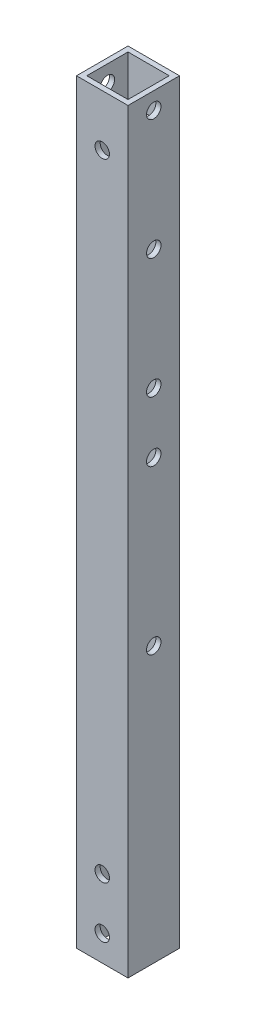
ISO-10303-21;
HEADER;
FILE_DESCRIPTION(('STEP AP214'),'2;1');
FILE_NAME('part.step','',(''),(''),'','','');
FILE_SCHEMA(('AUTOMOTIVE_DESIGN { 1 0 10303 214 1 1 1 1 }'));
ENDSEC;
DATA;
#1=APPLICATION_CONTEXT('core data for automotive mechanical design processes');
#2=APPLICATION_PROTOCOL_DEFINITION('international standard','automotive_design',2000,#1);
#3=PRODUCT_CONTEXT('',#1,'mechanical');
#4=PRODUCT('Part','Part','',(#3));
#5=PRODUCT_RELATED_PRODUCT_CATEGORY('part','',(#4));
#6=PRODUCT_DEFINITION_FORMATION('','',#4);
#7=PRODUCT_DEFINITION_CONTEXT('part definition',#1,'design');
#8=PRODUCT_DEFINITION('design','',#6,#7);
#9=PRODUCT_DEFINITION_SHAPE('','',#8);
#10=(LENGTH_UNIT() NAMED_UNIT(*) SI_UNIT(.MILLI.,.METRE.));
#11=(NAMED_UNIT(*) PLANE_ANGLE_UNIT() SI_UNIT($,.RADIAN.));
#12=(NAMED_UNIT(*) SI_UNIT($,.STERADIAN.) SOLID_ANGLE_UNIT());
#13=UNCERTAINTY_MEASURE_WITH_UNIT(LENGTH_MEASURE(1.E-05),#10,'distance_accuracy_value','');
#14=(GEOMETRIC_REPRESENTATION_CONTEXT(3) GLOBAL_UNCERTAINTY_ASSIGNED_CONTEXT((#13)) GLOBAL_UNIT_ASSIGNED_CONTEXT((#10,
#11,#12)) REPRESENTATION_CONTEXT('',''));
#15=CARTESIAN_POINT('',(0.,0.,0.));
#16=DIRECTION('',(0.,0.,1.));
#17=DIRECTION('',(1.,0.,0.));
#18=AXIS2_PLACEMENT_3D('',#15,#16,#17);
#19=CARTESIAN_POINT('',(0.,220.,0.));
#20=DIRECTION('',(0.,1.,0.));
#21=DIRECTION('',(0.,0.,1.));
#22=AXIS2_PLACEMENT_3D('',#19,#20,#21);
#23=PLANE('',#22);
#24=DIRECTION('',(0.,0.,-1.));
#25=VECTOR('',#24,1.);
#26=CARTESIAN_POINT('',(7.5,220.,-7.5));
#27=LINE('',#26,#25);
#28=CARTESIAN_POINT('',(7.5,220.,7.5));
#29=VERTEX_POINT('',#28);
#30=CARTESIAN_POINT('',(7.5,220.,-7.5));
#31=VERTEX_POINT('',#30);
#32=EDGE_CURVE('E164',#29,#31,#27,.T.);
#33=ORIENTED_EDGE('',*,*,#32,.T.);
#34=DIRECTION('',(-1.,0.,0.));
#35=VECTOR('',#34,1.);
#36=CARTESIAN_POINT('',(-7.5,220.,-7.5));
#37=LINE('',#36,#35);
#38=CARTESIAN_POINT('',(-7.5,220.,-7.5));
#39=VERTEX_POINT('',#38);
#40=EDGE_CURVE('E167',#31,#39,#37,.T.);
#41=ORIENTED_EDGE('',*,*,#40,.T.);
#42=DIRECTION('',(0.,0.,1.));
#43=VECTOR('',#42,1.);
#44=CARTESIAN_POINT('',(-7.5,220.,-7.5));
#45=LINE('',#44,#43);
#46=CARTESIAN_POINT('',(-7.5,220.,7.5));
#47=VERTEX_POINT('',#46);
#48=EDGE_CURVE('E170',#39,#47,#45,.T.);
#49=ORIENTED_EDGE('',*,*,#48,.T.);
#50=DIRECTION('',(1.,0.,0.));
#51=VECTOR('',#50,1.);
#52=CARTESIAN_POINT('',(-7.5,220.,7.5));
#53=LINE('',#52,#51);
#54=EDGE_CURVE('E172',#47,#29,#53,.T.);
#55=ORIENTED_EDGE('',*,*,#54,.T.);
#56=EDGE_LOOP('',(#33,#41,#49,#55));
#57=FACE_BOUND('',#56,.T.);
#58=DIRECTION('',(-1.,0.,0.));
#59=VECTOR('',#58,1.);
#60=CARTESIAN_POINT('',(-7.5,220.,-6.));
#61=LINE('',#60,#59);
#62=CARTESIAN_POINT('',(6.,220.,-6.));
#63=VERTEX_POINT('',#62);
#64=CARTESIAN_POINT('',(-6.,220.,-6.));
#65=VERTEX_POINT('',#64);
#66=EDGE_CURVE('E134',#63,#65,#61,.T.);
#67=ORIENTED_EDGE('',*,*,#66,.F.);
#68=DIRECTION('',(0.,0.,-1.));
#69=VECTOR('',#68,1.);
#70=CARTESIAN_POINT('',(6.,220.,-7.5));
#71=LINE('',#70,#69);
#72=CARTESIAN_POINT('',(6.,220.,6.));
#73=VERTEX_POINT('',#72);
#74=EDGE_CURVE('E126',#73,#63,#71,.T.);
#75=ORIENTED_EDGE('',*,*,#74,.F.);
#76=DIRECTION('',(1.,0.,0.));
#77=VECTOR('',#76,1.);
#78=CARTESIAN_POINT('',(-7.5,220.,6.));
#79=LINE('',#78,#77);
#80=CARTESIAN_POINT('',(-6.,220.,6.));
#81=VERTEX_POINT('',#80);
#82=EDGE_CURVE('E148',#81,#73,#79,.T.);
#83=ORIENTED_EDGE('',*,*,#82,.F.);
#84=DIRECTION('',(0.,0.,1.));
#85=VECTOR('',#84,1.);
#86=CARTESIAN_POINT('',(-6.,220.,-7.5));
#87=LINE('',#86,#85);
#88=EDGE_CURVE('E146',#65,#81,#87,.T.);
#89=ORIENTED_EDGE('',*,*,#88,.F.);
#90=EDGE_LOOP('',(#67,#75,#83,#89));
#91=FACE_BOUND('',#90,.T.);
#92=ADVANCED_FACE('F59',(#57,#91),#23,.T.);
#93=CARTESIAN_POINT('',(0.,0.,0.));
#94=DIRECTION('',(0.,1.,0.));
#95=DIRECTION('',(0.,0.,1.));
#96=AXIS2_PLACEMENT_3D('',#93,#94,#95);
#97=PLANE('',#96);
#98=DIRECTION('',(0.,0.,-1.));
#99=VECTOR('',#98,1.);
#100=CARTESIAN_POINT('',(7.5,0.,-7.5));
#101=LINE('',#100,#99);
#102=CARTESIAN_POINT('',(7.5,0.,7.5));
#103=VERTEX_POINT('',#102);
#104=CARTESIAN_POINT('',(7.5,0.,-7.5));
#105=VERTEX_POINT('',#104);
#106=EDGE_CURVE('E142',#103,#105,#101,.T.);
#107=ORIENTED_EDGE('',*,*,#106,.F.);
#108=DIRECTION('',(1.,0.,0.));
#109=VECTOR('',#108,1.);
#110=CARTESIAN_POINT('',(-7.5,0.,7.5));
#111=LINE('',#110,#109);
#112=CARTESIAN_POINT('',(-7.5,0.,7.5));
#113=VERTEX_POINT('',#112);
#114=EDGE_CURVE('E168',#113,#103,#111,.T.);
#115=ORIENTED_EDGE('',*,*,#114,.F.);
#116=DIRECTION('',(0.,0.,1.));
#117=VECTOR('',#116,1.);
#118=CARTESIAN_POINT('',(-7.5,0.,-7.5));
#119=LINE('',#118,#117);
#120=CARTESIAN_POINT('',(-7.5,0.,-7.5));
#121=VERTEX_POINT('',#120);
#122=EDGE_CURVE('E179',#121,#113,#119,.T.);
#123=ORIENTED_EDGE('',*,*,#122,.F.);
#124=DIRECTION('',(-1.,0.,0.));
#125=VECTOR('',#124,1.);
#126=CARTESIAN_POINT('',(-7.5,0.,-7.5));
#127=LINE('',#126,#125);
#128=EDGE_CURVE('E177',#105,#121,#127,.T.);
#129=ORIENTED_EDGE('',*,*,#128,.F.);
#130=EDGE_LOOP('',(#107,#115,#123,#129));
#131=FACE_BOUND('',#130,.T.);
#132=DIRECTION('',(0.,0.,-1.));
#133=VECTOR('',#132,1.);
#134=CARTESIAN_POINT('',(6.,0.,-7.5));
#135=LINE('',#134,#133);
#136=CARTESIAN_POINT('',(6.,0.,6.));
#137=VERTEX_POINT('',#136);
#138=CARTESIAN_POINT('',(6.,0.,-6.));
#139=VERTEX_POINT('',#138);
#140=EDGE_CURVE('E84',#137,#139,#135,.T.);
#141=ORIENTED_EDGE('',*,*,#140,.T.);
#142=DIRECTION('',(-1.,0.,0.));
#143=VECTOR('',#142,1.);
#144=CARTESIAN_POINT('',(-7.5,0.,-6.));
#145=LINE('',#144,#143);
#146=CARTESIAN_POINT('',(-6.,0.,-6.));
#147=VERTEX_POINT('',#146);
#148=EDGE_CURVE('E141',#139,#147,#145,.T.);
#149=ORIENTED_EDGE('',*,*,#148,.T.);
#150=DIRECTION('',(0.,0.,1.));
#151=VECTOR('',#150,1.);
#152=CARTESIAN_POINT('',(-6.,0.,-7.5));
#153=LINE('',#152,#151);
#154=CARTESIAN_POINT('',(-6.,0.,6.));
#155=VERTEX_POINT('',#154);
#156=EDGE_CURVE('E156',#147,#155,#153,.T.);
#157=ORIENTED_EDGE('',*,*,#156,.T.);
#158=DIRECTION('',(1.,0.,0.));
#159=VECTOR('',#158,1.);
#160=CARTESIAN_POINT('',(-7.5,0.,6.));
#161=LINE('',#160,#159);
#162=EDGE_CURVE('E135',#155,#137,#161,.T.);
#163=ORIENTED_EDGE('',*,*,#162,.T.);
#164=EDGE_LOOP('',(#141,#149,#157,#163));
#165=FACE_BOUND('',#164,.T.);
#166=ADVANCED_FACE('F305',(#131,#165),#97,.F.);
#167=CARTESIAN_POINT('',(7.5,220.,-7.5));
#168=DIRECTION('',(-1.,0.,0.));
#169=DIRECTION('',(0.,0.,1.));
#170=AXIS2_PLACEMENT_3D('',#167,#168,#169);
#171=PLANE('',#170);
#172=CARTESIAN_POINT('',(7.5,80.,0.));
#173=DIRECTION('',(1.,0.,0.));
#174=DIRECTION('',(0.,0.,-1.));
#175=AXIS2_PLACEMENT_3D('',#172,#173,#174);
#176=CIRCLE('',#175,2.1);
#177=CARTESIAN_POINT('',(7.5,80.,-2.10000000000002));
#178=VERTEX_POINT('',#177);
#179=EDGE_CURVE('E224',#178,#178,#176,.T.);
#180=ORIENTED_EDGE('',*,*,#179,.F.);
#181=EDGE_LOOP('',(#180));
#182=FACE_BOUND('',#181,.T.);
#183=CARTESIAN_POINT('',(7.5,127.5,0.));
#184=DIRECTION('',(1.,0.,0.));
#185=DIRECTION('',(0.,0.,-1.));
#186=AXIS2_PLACEMENT_3D('',#183,#184,#185);
#187=CIRCLE('',#186,2.09999999999999);
#188=CARTESIAN_POINT('',(7.5,127.5,-2.1));
#189=VERTEX_POINT('',#188);
#190=EDGE_CURVE('E234',#189,#189,#187,.T.);
#191=ORIENTED_EDGE('',*,*,#190,.F.);
#192=EDGE_LOOP('',(#191));
#193=FACE_BOUND('',#192,.T.);
#194=CARTESIAN_POINT('',(7.5,145.,0.));
#195=DIRECTION('',(1.,0.,0.));
#196=DIRECTION('',(0.,0.,-1.));
#197=AXIS2_PLACEMENT_3D('',#194,#195,#196);
#198=CIRCLE('',#197,2.1);
#199=CARTESIAN_POINT('',(7.5,145.,-2.10000000000001));
#200=VERTEX_POINT('',#199);
#201=EDGE_CURVE('E265',#200,#200,#198,.T.);
#202=ORIENTED_EDGE('',*,*,#201,.F.);
#203=EDGE_LOOP('',(#202));
#204=FACE_BOUND('',#203,.T.);
#205=CARTESIAN_POINT('',(7.5,180.,0.));
#206=DIRECTION('',(1.,0.,0.));
#207=DIRECTION('',(0.,0.,-1.));
#208=AXIS2_PLACEMENT_3D('',#205,#206,#207);
#209=CIRCLE('',#208,2.09999999999999);
#210=CARTESIAN_POINT('',(7.5,180.,-2.1));
#211=VERTEX_POINT('',#210);
#212=EDGE_CURVE('E262',#211,#211,#209,.T.);
#213=ORIENTED_EDGE('',*,*,#212,.F.);
#214=EDGE_LOOP('',(#213));
#215=FACE_BOUND('',#214,.T.);
#216=CARTESIAN_POINT('',(7.5,215.,0.));
#217=DIRECTION('',(1.,0.,0.));
#218=DIRECTION('',(0.,0.,-1.));
#219=AXIS2_PLACEMENT_3D('',#216,#217,#218);
#220=CIRCLE('',#219,2.09999999999999);
#221=CARTESIAN_POINT('',(7.5,215.,-2.09999999999998));
#222=VERTEX_POINT('',#221);
#223=EDGE_CURVE('E277',#222,#222,#220,.T.);
#224=ORIENTED_EDGE('',*,*,#223,.F.);
#225=EDGE_LOOP('',(#224));
#226=FACE_BOUND('',#225,.T.);
#227=ORIENTED_EDGE('',*,*,#106,.T.);
#228=DIRECTION('',(0.,-1.,0.));
#229=VECTOR('',#228,1.);
#230=CARTESIAN_POINT('',(7.5,220.,-7.5));
#231=LINE('',#230,#229);
#232=EDGE_CURVE('E12',#31,#105,#231,.T.);
#233=ORIENTED_EDGE('',*,*,#232,.F.);
#234=ORIENTED_EDGE('',*,*,#32,.F.);
#235=DIRECTION('',(0.,-1.,0.));
#236=VECTOR('',#235,1.);
#237=CARTESIAN_POINT('',(7.5,220.,7.5));
#238=LINE('',#237,#236);
#239=EDGE_CURVE('E174',#29,#103,#238,.T.);
#240=ORIENTED_EDGE('',*,*,#239,.T.);
#241=EDGE_LOOP('',(#227,#233,#234,#240));
#242=FACE_BOUND('',#241,.T.);
#243=ADVANCED_FACE('F61',(#182,#193,#204,#215,#226,#242),#171,.F.);
#244=CARTESIAN_POINT('',(-7.5,220.,-7.5));
#245=DIRECTION('',(0.,0.,1.));
#246=DIRECTION('',(1.,0.,0.));
#247=AXIS2_PLACEMENT_3D('',#244,#245,#246);
#248=PLANE('',#247);
#249=CARTESIAN_POINT('',(0.,22.5,-7.5));
#250=DIRECTION('',(0.,0.,1.));
#251=DIRECTION('',(1.,0.,0.));
#252=AXIS2_PLACEMENT_3D('',#249,#250,#251);
#253=CIRCLE('',#252,2.1);
#254=CARTESIAN_POINT('',(2.1,22.5,-7.5));
#255=VERTEX_POINT('',#254);
#256=EDGE_CURVE('E211',#255,#255,#253,.T.);
#257=ORIENTED_EDGE('',*,*,#256,.T.);
#258=EDGE_LOOP('',(#257));
#259=FACE_BOUND('',#258,.T.);
#260=CARTESIAN_POINT('',(0.,7.5,-7.5));
#261=DIRECTION('',(0.,0.,1.));
#262=DIRECTION('',(1.,0.,0.));
#263=AXIS2_PLACEMENT_3D('',#260,#261,#262);
#264=CIRCLE('',#263,2.1);
#265=CARTESIAN_POINT('',(2.1,7.5,-7.5));
#266=VERTEX_POINT('',#265);
#267=EDGE_CURVE('E246',#266,#266,#264,.T.);
#268=ORIENTED_EDGE('',*,*,#267,.T.);
#269=EDGE_LOOP('',(#268));
#270=FACE_BOUND('',#269,.T.);
#271=CARTESIAN_POINT('',(0.,205.,-7.5));
#272=DIRECTION('',(0.,0.,1.));
#273=DIRECTION('',(1.,0.,0.));
#274=AXIS2_PLACEMENT_3D('',#271,#272,#273);
#275=CIRCLE('',#274,2.09999999999999);
#276=CARTESIAN_POINT('',(2.09999999999999,205.,-7.5));
#277=VERTEX_POINT('',#276);
#278=EDGE_CURVE('E206',#277,#277,#275,.T.);
#279=ORIENTED_EDGE('',*,*,#278,.T.);
#280=EDGE_LOOP('',(#279));
#281=FACE_BOUND('',#280,.T.);
#282=ORIENTED_EDGE('',*,*,#128,.T.);
#283=DIRECTION('',(0.,-1.,0.));
#284=VECTOR('',#283,1.);
#285=CARTESIAN_POINT('',(-7.5,220.,-7.5));
#286=LINE('',#285,#284);
#287=EDGE_CURVE('E68',#39,#121,#286,.T.);
#288=ORIENTED_EDGE('',*,*,#287,.F.);
#289=ORIENTED_EDGE('',*,*,#40,.F.);
#290=ORIENTED_EDGE('',*,*,#232,.T.);
#291=EDGE_LOOP('',(#282,#288,#289,#290));
#292=FACE_BOUND('',#291,.T.);
#293=ADVANCED_FACE('F314',(#259,#270,#281,#292),#248,.F.);
#294=CARTESIAN_POINT('',(-7.5,220.,-7.5));
#295=DIRECTION('',(1.,0.,0.));
#296=DIRECTION('',(0.,0.,-1.));
#297=AXIS2_PLACEMENT_3D('',#294,#295,#296);
#298=PLANE('',#297);
#299=CARTESIAN_POINT('',(-7.50000000000001,80.,0.));
#300=DIRECTION('',(1.,0.,0.));
#301=DIRECTION('',(0.,0.,-1.));
#302=AXIS2_PLACEMENT_3D('',#299,#300,#301);
#303=CIRCLE('',#302,2.1);
#304=CARTESIAN_POINT('',(-7.50000000000001,80.,-2.10000000000002));
#305=VERTEX_POINT('',#304);
#306=EDGE_CURVE('E218',#305,#305,#303,.T.);
#307=ORIENTED_EDGE('',*,*,#306,.T.);
#308=EDGE_LOOP('',(#307));
#309=FACE_BOUND('',#308,.T.);
#310=CARTESIAN_POINT('',(-7.50000000000001,127.5,0.));
#311=DIRECTION('',(1.,0.,0.));
#312=DIRECTION('',(0.,0.,-1.));
#313=AXIS2_PLACEMENT_3D('',#310,#311,#312);
#314=CIRCLE('',#313,2.09999999999999);
#315=CARTESIAN_POINT('',(-7.50000000000001,127.5,-2.1));
#316=VERTEX_POINT('',#315);
#317=EDGE_CURVE('E229',#316,#316,#314,.T.);
#318=ORIENTED_EDGE('',*,*,#317,.T.);
#319=EDGE_LOOP('',(#318));
#320=FACE_BOUND('',#319,.T.);
#321=CARTESIAN_POINT('',(-7.5,145.,0.));
#322=DIRECTION('',(1.,0.,0.));
#323=DIRECTION('',(0.,0.,-1.));
#324=AXIS2_PLACEMENT_3D('',#321,#322,#323);
#325=CIRCLE('',#324,2.1);
#326=CARTESIAN_POINT('',(-7.5,145.,-2.10000000000001));
#327=VERTEX_POINT('',#326);
#328=EDGE_CURVE('E197',#327,#327,#325,.T.);
#329=ORIENTED_EDGE('',*,*,#328,.T.);
#330=EDGE_LOOP('',(#329));
#331=FACE_BOUND('',#330,.T.);
#332=CARTESIAN_POINT('',(-7.5,180.,0.));
#333=DIRECTION('',(1.,0.,0.));
#334=DIRECTION('',(0.,0.,-1.));
#335=AXIS2_PLACEMENT_3D('',#332,#333,#334);
#336=CIRCLE('',#335,2.09999999999999);
#337=CARTESIAN_POINT('',(-7.5,180.,-2.1));
#338=VERTEX_POINT('',#337);
#339=EDGE_CURVE('E268',#338,#338,#336,.T.);
#340=ORIENTED_EDGE('',*,*,#339,.T.);
#341=EDGE_LOOP('',(#340));
#342=FACE_BOUND('',#341,.T.);
#343=CARTESIAN_POINT('',(-7.5,215.,0.));
#344=DIRECTION('',(1.,0.,0.));
#345=DIRECTION('',(0.,0.,-1.));
#346=AXIS2_PLACEMENT_3D('',#343,#344,#345);
#347=CIRCLE('',#346,2.09999999999999);
#348=CARTESIAN_POINT('',(-7.5,215.,-2.09999999999998));
#349=VERTEX_POINT('',#348);
#350=EDGE_CURVE('E192',#349,#349,#347,.T.);
#351=ORIENTED_EDGE('',*,*,#350,.T.);
#352=EDGE_LOOP('',(#351));
#353=FACE_BOUND('',#352,.T.);
#354=ORIENTED_EDGE('',*,*,#122,.T.);
#355=DIRECTION('',(0.,-1.,0.));
#356=VECTOR('',#355,1.);
#357=CARTESIAN_POINT('',(-7.5,220.,7.5));
#358=LINE('',#357,#356);
#359=EDGE_CURVE('E184',#47,#113,#358,.T.);
#360=ORIENTED_EDGE('',*,*,#359,.F.);
#361=ORIENTED_EDGE('',*,*,#48,.F.);
#362=ORIENTED_EDGE('',*,*,#287,.T.);
#363=EDGE_LOOP('',(#354,#360,#361,#362));
#364=FACE_BOUND('',#363,.T.);
#365=ADVANCED_FACE('F298',(#309,#320,#331,#342,#353,#364),#298,.F.);
#366=CARTESIAN_POINT('',(-7.5,220.,7.5));
#367=DIRECTION('',(0.,0.,-1.));
#368=DIRECTION('',(-1.,0.,0.));
#369=AXIS2_PLACEMENT_3D('',#366,#367,#368);
#370=PLANE('',#369);
#371=CARTESIAN_POINT('',(0.,22.5,7.5));
#372=DIRECTION('',(0.,0.,1.));
#373=DIRECTION('',(1.,0.,0.));
#374=AXIS2_PLACEMENT_3D('',#371,#372,#373);
#375=CIRCLE('',#374,2.1);
#376=CARTESIAN_POINT('',(2.1,22.5,7.5));
#377=VERTEX_POINT('',#376);
#378=EDGE_CURVE('E243',#377,#377,#375,.T.);
#379=ORIENTED_EDGE('',*,*,#378,.F.);
#380=EDGE_LOOP('',(#379));
#381=FACE_BOUND('',#380,.T.);
#382=CARTESIAN_POINT('',(0.,7.5,7.5));
#383=DIRECTION('',(0.,0.,1.));
#384=DIRECTION('',(1.,0.,0.));
#385=AXIS2_PLACEMENT_3D('',#382,#383,#384);
#386=CIRCLE('',#385,2.1);
#387=CARTESIAN_POINT('',(2.1,7.5,7.5));
#388=VERTEX_POINT('',#387);
#389=EDGE_CURVE('E240',#388,#388,#386,.T.);
#390=ORIENTED_EDGE('',*,*,#389,.F.);
#391=EDGE_LOOP('',(#390));
#392=FACE_BOUND('',#391,.T.);
#393=CARTESIAN_POINT('',(0.,205.,7.5));
#394=DIRECTION('',(0.,0.,1.));
#395=DIRECTION('',(1.,0.,0.));
#396=AXIS2_PLACEMENT_3D('',#393,#394,#395);
#397=CIRCLE('',#396,2.09999999999999);
#398=CARTESIAN_POINT('',(2.09999999999999,205.,7.5));
#399=VERTEX_POINT('',#398);
#400=EDGE_CURVE('E255',#399,#399,#397,.T.);
#401=ORIENTED_EDGE('',*,*,#400,.F.);
#402=EDGE_LOOP('',(#401));
#403=FACE_BOUND('',#402,.T.);
#404=ORIENTED_EDGE('',*,*,#114,.T.);
#405=ORIENTED_EDGE('',*,*,#239,.F.);
#406=ORIENTED_EDGE('',*,*,#54,.F.);
#407=ORIENTED_EDGE('',*,*,#359,.T.);
#408=EDGE_LOOP('',(#404,#405,#406,#407));
#409=FACE_BOUND('',#408,.T.);
#410=ADVANCED_FACE('F288',(#381,#392,#403,#409),#370,.F.);
#411=CARTESIAN_POINT('',(6.,220.,-7.5));
#412=DIRECTION('',(-1.,0.,0.));
#413=DIRECTION('',(0.,0.,1.));
#414=AXIS2_PLACEMENT_3D('',#411,#412,#413);
#415=PLANE('',#414);
#416=CARTESIAN_POINT('',(6.,80.,0.));
#417=DIRECTION('',(-1.,0.,0.));
#418=DIRECTION('',(0.,0.,1.));
#419=AXIS2_PLACEMENT_3D('',#416,#417,#418);
#420=CIRCLE('',#419,2.1);
#421=CARTESIAN_POINT('',(6.,80.,2.09999999999999));
#422=VERTEX_POINT('',#421);
#423=EDGE_CURVE('E237',#422,#422,#420,.T.);
#424=ORIENTED_EDGE('',*,*,#423,.F.);
#425=EDGE_LOOP('',(#424));
#426=FACE_BOUND('',#425,.T.);
#427=CARTESIAN_POINT('',(6.,127.5,0.));
#428=DIRECTION('',(-1.,0.,0.));
#429=DIRECTION('',(0.,0.,1.));
#430=AXIS2_PLACEMENT_3D('',#427,#428,#429);
#431=CIRCLE('',#430,2.09999999999999);
#432=CARTESIAN_POINT('',(6.,127.5,2.09999999999998));
#433=VERTEX_POINT('',#432);
#434=EDGE_CURVE('E217',#433,#433,#431,.T.);
#435=ORIENTED_EDGE('',*,*,#434,.F.);
#436=EDGE_LOOP('',(#435));
#437=FACE_BOUND('',#436,.T.);
#438=CARTESIAN_POINT('',(6.,145.,0.));
#439=DIRECTION('',(-1.,0.,0.));
#440=DIRECTION('',(0.,0.,1.));
#441=AXIS2_PLACEMENT_3D('',#438,#439,#440);
#442=CIRCLE('',#441,2.1);
#443=CARTESIAN_POINT('',(6.,145.,2.09999999999999));
#444=VERTEX_POINT('',#443);
#445=EDGE_CURVE('E201',#444,#444,#442,.T.);
#446=ORIENTED_EDGE('',*,*,#445,.F.);
#447=EDGE_LOOP('',(#446));
#448=FACE_BOUND('',#447,.T.);
#449=CARTESIAN_POINT('',(6.,180.,0.));
#450=DIRECTION('',(-1.,0.,0.));
#451=DIRECTION('',(0.,0.,1.));
#452=AXIS2_PLACEMENT_3D('',#449,#450,#451);
#453=CIRCLE('',#452,2.09999999999999);
#454=CARTESIAN_POINT('',(6.,180.,2.09999999999999));
#455=VERTEX_POINT('',#454);
#456=EDGE_CURVE('E196',#455,#455,#453,.T.);
#457=ORIENTED_EDGE('',*,*,#456,.F.);
#458=EDGE_LOOP('',(#457));
#459=FACE_BOUND('',#458,.T.);
#460=CARTESIAN_POINT('',(6.,215.,0.));
#461=DIRECTION('',(-1.,0.,0.));
#462=DIRECTION('',(0.,0.,1.));
#463=AXIS2_PLACEMENT_3D('',#460,#461,#462);
#464=CIRCLE('',#463,2.09999999999999);
#465=CARTESIAN_POINT('',(6.,215.,-2.09999999999998));
#466=VERTEX_POINT('',#465);
#467=EDGE_CURVE('E154',#466,#466,#464,.T.);
#468=ORIENTED_EDGE('',*,*,#467,.F.);
#469=EDGE_LOOP('',(#468));
#470=FACE_BOUND('',#469,.T.);
#471=ORIENTED_EDGE('',*,*,#140,.F.);
#472=DIRECTION('',(0.,-1.,0.));
#473=VECTOR('',#472,1.);
#474=CARTESIAN_POINT('',(6.,220.,6.));
#475=LINE('',#474,#473);
#476=EDGE_CURVE('E130',#73,#137,#475,.T.);
#477=ORIENTED_EDGE('',*,*,#476,.F.);
#478=ORIENTED_EDGE('',*,*,#74,.T.);
#479=DIRECTION('',(0.,-1.,0.));
#480=VECTOR('',#479,1.);
#481=CARTESIAN_POINT('',(6.,220.,-6.));
#482=LINE('',#481,#480);
#483=EDGE_CURVE('E129',#63,#139,#482,.T.);
#484=ORIENTED_EDGE('',*,*,#483,.T.);
#485=EDGE_LOOP('',(#471,#477,#478,#484));
#486=FACE_BOUND('',#485,.T.);
#487=ADVANCED_FACE('F128',(#426,#437,#448,#459,#470,#486),#415,.T.);
#488=CARTESIAN_POINT('',(-7.5,220.,-6.));
#489=DIRECTION('',(0.,0.,1.));
#490=DIRECTION('',(1.,0.,0.));
#491=AXIS2_PLACEMENT_3D('',#488,#489,#490);
#492=PLANE('',#491);
#493=CARTESIAN_POINT('',(0.,22.5,-6.));
#494=DIRECTION('',(0.,0.,1.));
#495=DIRECTION('',(1.,0.,0.));
#496=AXIS2_PLACEMENT_3D('',#493,#494,#495);
#497=CIRCLE('',#496,2.1);
#498=CARTESIAN_POINT('',(2.1,22.5,-6.));
#499=VERTEX_POINT('',#498);
#500=EDGE_CURVE('E214',#499,#499,#497,.T.);
#501=ORIENTED_EDGE('',*,*,#500,.F.);
#502=EDGE_LOOP('',(#501));
#503=FACE_BOUND('',#502,.T.);
#504=CARTESIAN_POINT('',(0.,7.5,-6.));
#505=DIRECTION('',(0.,0.,1.));
#506=DIRECTION('',(1.,0.,0.));
#507=AXIS2_PLACEMENT_3D('',#504,#505,#506);
#508=CIRCLE('',#507,2.1);
#509=CARTESIAN_POINT('',(2.1,7.5,-6.));
#510=VERTEX_POINT('',#509);
#511=EDGE_CURVE('E210',#510,#510,#508,.T.);
#512=ORIENTED_EDGE('',*,*,#511,.F.);
#513=EDGE_LOOP('',(#512));
#514=FACE_BOUND('',#513,.T.);
#515=CARTESIAN_POINT('',(0.,205.,-6.));
#516=DIRECTION('',(0.,0.,1.));
#517=DIRECTION('',(1.,0.,0.));
#518=AXIS2_PLACEMENT_3D('',#515,#516,#517);
#519=CIRCLE('',#518,2.09999999999999);
#520=CARTESIAN_POINT('',(2.09999999999999,205.,-6.));
#521=VERTEX_POINT('',#520);
#522=EDGE_CURVE('E205',#521,#521,#519,.T.);
#523=ORIENTED_EDGE('',*,*,#522,.F.);
#524=EDGE_LOOP('',(#523));
#525=FACE_BOUND('',#524,.T.);
#526=ORIENTED_EDGE('',*,*,#148,.F.);
#527=ORIENTED_EDGE('',*,*,#483,.F.);
#528=ORIENTED_EDGE('',*,*,#66,.T.);
#529=DIRECTION('',(0.,-1.,0.));
#530=VECTOR('',#529,1.);
#531=CARTESIAN_POINT('',(-6.,220.,-6.));
#532=LINE('',#531,#530);
#533=EDGE_CURVE('E143',#65,#147,#532,.T.);
#534=ORIENTED_EDGE('',*,*,#533,.T.);
#535=EDGE_LOOP('',(#526,#527,#528,#534));
#536=FACE_BOUND('',#535,.T.);
#537=ADVANCED_FACE('F138',(#503,#514,#525,#536),#492,.T.);
#538=CARTESIAN_POINT('',(-6.,220.,-7.5));
#539=DIRECTION('',(1.,0.,0.));
#540=DIRECTION('',(0.,0.,-1.));
#541=AXIS2_PLACEMENT_3D('',#538,#539,#540);
#542=PLANE('',#541);
#543=CARTESIAN_POINT('',(-6.,80.,0.));
#544=DIRECTION('',(1.,0.,0.));
#545=DIRECTION('',(0.,0.,-1.));
#546=AXIS2_PLACEMENT_3D('',#543,#544,#545);
#547=CIRCLE('',#546,2.1);
#548=CARTESIAN_POINT('',(-6.,80.,-2.10000000000002));
#549=VERTEX_POINT('',#548);
#550=EDGE_CURVE('E63',#549,#549,#547,.T.);
#551=ORIENTED_EDGE('',*,*,#550,.F.);
#552=EDGE_LOOP('',(#551));
#553=FACE_BOUND('',#552,.T.);
#554=CARTESIAN_POINT('',(-6.,127.5,0.));
#555=DIRECTION('',(1.,0.,0.));
#556=DIRECTION('',(0.,0.,-1.));
#557=AXIS2_PLACEMENT_3D('',#554,#555,#556);
#558=CIRCLE('',#557,2.09999999999999);
#559=CARTESIAN_POINT('',(-6.,127.5,-2.1));
#560=VERTEX_POINT('',#559);
#561=EDGE_CURVE('E215',#560,#560,#558,.T.);
#562=ORIENTED_EDGE('',*,*,#561,.F.);
#563=EDGE_LOOP('',(#562));
#564=FACE_BOUND('',#563,.T.);
#565=CARTESIAN_POINT('',(-6.,145.,0.));
#566=DIRECTION('',(1.,0.,0.));
#567=DIRECTION('',(0.,0.,-1.));
#568=AXIS2_PLACEMENT_3D('',#565,#566,#567);
#569=CIRCLE('',#568,2.1);
#570=CARTESIAN_POINT('',(-6.,145.,-2.10000000000001));
#571=VERTEX_POINT('',#570);
#572=EDGE_CURVE('E198',#571,#571,#569,.T.);
#573=ORIENTED_EDGE('',*,*,#572,.F.);
#574=EDGE_LOOP('',(#573));
#575=FACE_BOUND('',#574,.T.);
#576=CARTESIAN_POINT('',(-6.,180.,0.));
#577=DIRECTION('',(1.,0.,0.));
#578=DIRECTION('',(0.,0.,-1.));
#579=AXIS2_PLACEMENT_3D('',#576,#577,#578);
#580=CIRCLE('',#579,2.09999999999999);
#581=CARTESIAN_POINT('',(-6.,180.,-2.1));
#582=VERTEX_POINT('',#581);
#583=EDGE_CURVE('E193',#582,#582,#580,.T.);
#584=ORIENTED_EDGE('',*,*,#583,.F.);
#585=EDGE_LOOP('',(#584));
#586=FACE_BOUND('',#585,.T.);
#587=CARTESIAN_POINT('',(-6.,215.,0.));
#588=DIRECTION('',(1.,0.,0.));
#589=DIRECTION('',(0.,0.,-1.));
#590=AXIS2_PLACEMENT_3D('',#587,#588,#589);
#591=CIRCLE('',#590,2.09999999999999);
#592=CARTESIAN_POINT('',(-6.,215.,-2.09999999999998));
#593=VERTEX_POINT('',#592);
#594=EDGE_CURVE('E189',#593,#593,#591,.T.);
#595=ORIENTED_EDGE('',*,*,#594,.F.);
#596=EDGE_LOOP('',(#595));
#597=FACE_BOUND('',#596,.T.);
#598=ORIENTED_EDGE('',*,*,#156,.F.);
#599=ORIENTED_EDGE('',*,*,#533,.F.);
#600=ORIENTED_EDGE('',*,*,#88,.T.);
#601=DIRECTION('',(0.,-1.,0.));
#602=VECTOR('',#601,1.);
#603=CARTESIAN_POINT('',(-6.,220.,6.));
#604=LINE('',#603,#602);
#605=EDGE_CURVE('E76',#81,#155,#604,.T.);
#606=ORIENTED_EDGE('',*,*,#605,.T.);
#607=EDGE_LOOP('',(#598,#599,#600,#606));
#608=FACE_BOUND('',#607,.T.);
#609=ADVANCED_FACE('F295',(#553,#564,#575,#586,#597,#608),#542,.T.);
#610=CARTESIAN_POINT('',(-7.5,220.,6.));
#611=DIRECTION('',(0.,0.,-1.));
#612=DIRECTION('',(-1.,0.,0.));
#613=AXIS2_PLACEMENT_3D('',#610,#611,#612);
#614=PLANE('',#613);
#615=CARTESIAN_POINT('',(0.,22.5,6.));
#616=DIRECTION('',(0.,0.,-1.));
#617=DIRECTION('',(-1.,0.,0.));
#618=AXIS2_PLACEMENT_3D('',#615,#616,#617);
#619=CIRCLE('',#618,2.1);
#620=CARTESIAN_POINT('',(-2.1,22.5,6.));
#621=VERTEX_POINT('',#620);
#622=EDGE_CURVE('E212',#621,#621,#619,.T.);
#623=ORIENTED_EDGE('',*,*,#622,.F.);
#624=EDGE_LOOP('',(#623));
#625=FACE_BOUND('',#624,.T.);
#626=CARTESIAN_POINT('',(0.,7.5,6.));
#627=DIRECTION('',(0.,0.,-1.));
#628=DIRECTION('',(-1.,0.,0.));
#629=AXIS2_PLACEMENT_3D('',#626,#627,#628);
#630=CIRCLE('',#629,2.1);
#631=CARTESIAN_POINT('',(-2.1,7.5,6.));
#632=VERTEX_POINT('',#631);
#633=EDGE_CURVE('E207',#632,#632,#630,.T.);
#634=ORIENTED_EDGE('',*,*,#633,.F.);
#635=EDGE_LOOP('',(#634));
#636=FACE_BOUND('',#635,.T.);
#637=CARTESIAN_POINT('',(0.,205.,6.));
#638=DIRECTION('',(0.,0.,-1.));
#639=DIRECTION('',(-1.,0.,0.));
#640=AXIS2_PLACEMENT_3D('',#637,#638,#639);
#641=CIRCLE('',#640,2.09999999999999);
#642=CARTESIAN_POINT('',(-2.09999999999999,205.,6.));
#643=VERTEX_POINT('',#642);
#644=EDGE_CURVE('E202',#643,#643,#641,.T.);
#645=ORIENTED_EDGE('',*,*,#644,.F.);
#646=EDGE_LOOP('',(#645));
#647=FACE_BOUND('',#646,.T.);
#648=ORIENTED_EDGE('',*,*,#162,.F.);
#649=ORIENTED_EDGE('',*,*,#605,.F.);
#650=ORIENTED_EDGE('',*,*,#82,.T.);
#651=ORIENTED_EDGE('',*,*,#476,.T.);
#652=EDGE_LOOP('',(#648,#649,#650,#651));
#653=FACE_BOUND('',#652,.T.);
#654=ADVANCED_FACE('F342',(#625,#636,#647,#653),#614,.T.);
#655=CARTESIAN_POINT('',(-7.5,215.,0.));
#656=DIRECTION('',(1.,0.,0.));
#657=DIRECTION('',(0.,0.,-1.));
#658=AXIS2_PLACEMENT_3D('',#655,#656,#657);
#659=CYLINDRICAL_SURFACE('',#658,2.09999999999999);
#660=CARTESIAN_POINT('',(-6.,215.,-2.09999999999998));
#661=CARTESIAN_POINT('',(-6.015625,215.,-2.09999999999998));
#662=CARTESIAN_POINT('',(-6.03125,215.,-2.09999999999998));
#663=CARTESIAN_POINT('',(-6.0625,215.,-2.09999999999998));
#664=CARTESIAN_POINT('',(-6.078125,215.,-2.09999999999998));
#665=CARTESIAN_POINT('',(-6.109375,215.,-2.09999999999998));
#666=CARTESIAN_POINT('',(-6.125,215.,-2.09999999999998));
#667=CARTESIAN_POINT('',(-6.15625,215.,-2.09999999999998));
#668=CARTESIAN_POINT('',(-6.171875,215.,-2.09999999999998));
#669=CARTESIAN_POINT('',(-6.203125,215.,-2.09999999999998));
#670=CARTESIAN_POINT('',(-6.21875,215.,-2.09999999999998));
#671=CARTESIAN_POINT('',(-6.25,215.,-2.09999999999998));
#672=CARTESIAN_POINT('',(-6.265625,215.,-2.09999999999998));
#673=CARTESIAN_POINT('',(-6.296875,215.,-2.09999999999998));
#674=CARTESIAN_POINT('',(-6.3125,215.,-2.09999999999998));
#675=CARTESIAN_POINT('',(-6.34375,215.,-2.09999999999998));
#676=CARTESIAN_POINT('',(-6.359375,215.,-2.09999999999998));
#677=CARTESIAN_POINT('',(-6.390625,215.,-2.09999999999998));
#678=CARTESIAN_POINT('',(-6.40625,215.,-2.09999999999998));
#679=CARTESIAN_POINT('',(-6.4375,215.,-2.09999999999998));
#680=CARTESIAN_POINT('',(-6.453125,215.,-2.09999999999998));
#681=CARTESIAN_POINT('',(-6.484375,215.,-2.09999999999998));
#682=CARTESIAN_POINT('',(-6.5,215.,-2.09999999999998));
#683=CARTESIAN_POINT('',(-6.53125,215.,-2.09999999999998));
#684=CARTESIAN_POINT('',(-6.546875,215.,-2.09999999999998));
#685=CARTESIAN_POINT('',(-6.578125,215.,-2.09999999999998));
#686=CARTESIAN_POINT('',(-6.59375,215.,-2.09999999999998));
#687=CARTESIAN_POINT('',(-6.625,215.,-2.09999999999998));
#688=CARTESIAN_POINT('',(-6.640625,215.,-2.09999999999998));
#689=CARTESIAN_POINT('',(-6.671875,215.,-2.09999999999998));
#690=CARTESIAN_POINT('',(-6.6875,215.,-2.09999999999998));
#691=CARTESIAN_POINT('',(-6.71875,215.,-2.09999999999998));
#692=CARTESIAN_POINT('',(-6.734375,215.,-2.09999999999998));
#693=CARTESIAN_POINT('',(-6.765625,215.,-2.09999999999998));
#694=CARTESIAN_POINT('',(-6.78125,215.,-2.09999999999998));
#695=CARTESIAN_POINT('',(-6.8125,215.,-2.09999999999998));
#696=CARTESIAN_POINT('',(-6.828125,215.,-2.09999999999998));
#697=CARTESIAN_POINT('',(-6.859375,215.,-2.09999999999998));
#698=CARTESIAN_POINT('',(-6.875,215.,-2.09999999999998));
#699=CARTESIAN_POINT('',(-6.90625,215.,-2.09999999999998));
#700=CARTESIAN_POINT('',(-6.921875,215.,-2.09999999999998));
#701=CARTESIAN_POINT('',(-6.953125,215.,-2.09999999999998));
#702=CARTESIAN_POINT('',(-6.96875,215.,-2.09999999999998));
#703=CARTESIAN_POINT('',(-7.,215.,-2.09999999999998));
#704=CARTESIAN_POINT('',(-7.015625,215.,-2.09999999999998));
#705=CARTESIAN_POINT('',(-7.046875,215.,-2.09999999999998));
#706=CARTESIAN_POINT('',(-7.0625,215.,-2.09999999999998));
#707=CARTESIAN_POINT('',(-7.09375,215.,-2.09999999999998));
#708=CARTESIAN_POINT('',(-7.109375,215.,-2.09999999999998));
#709=CARTESIAN_POINT('',(-7.140625,215.,-2.09999999999998));
#710=CARTESIAN_POINT('',(-7.15625,215.,-2.09999999999998));
#711=CARTESIAN_POINT('',(-7.1875,215.,-2.09999999999998));
#712=CARTESIAN_POINT('',(-7.203125,215.,-2.09999999999998));
#713=CARTESIAN_POINT('',(-7.234375,215.,-2.09999999999998));
#714=CARTESIAN_POINT('',(-7.25,215.,-2.09999999999998));
#715=CARTESIAN_POINT('',(-7.28125,215.,-2.09999999999998));
#716=CARTESIAN_POINT('',(-7.296875,215.,-2.09999999999998));
#717=CARTESIAN_POINT('',(-7.328125,215.,-2.09999999999998));
#718=CARTESIAN_POINT('',(-7.34375,215.,-2.09999999999998));
#719=CARTESIAN_POINT('',(-7.375,215.,-2.09999999999998));
#720=CARTESIAN_POINT('',(-7.390625,215.,-2.09999999999998));
#721=CARTESIAN_POINT('',(-7.421875,215.,-2.09999999999998));
#722=CARTESIAN_POINT('',(-7.4375,215.,-2.09999999999998));
#723=CARTESIAN_POINT('',(-7.46875,215.,-2.09999999999998));
#724=CARTESIAN_POINT('',(-7.484375,215.,-2.09999999999998));
#725=CARTESIAN_POINT('',(-7.5,215.,-2.09999999999998));
#726=B_SPLINE_CURVE_WITH_KNOTS('',3,(#660,#661,#662,#663,#664,#665,#666,#667,#668,#669,#670,
#671,#672,#673,#674,#675,#676,#677,#678,#679,#680,#681,#682,#683,#684,#685,#686,#687,#688,#689,
#690,#691,#692,#693,#694,#695,#696,#697,#698,#699,#700,#701,#702,#703,#704,#705,#706,#707,#708,
#709,#710,#711,#712,#713,#714,#715,#716,#717,#718,#719,#720,#721,#722,#723,#724,#725),
.UNSPECIFIED.,.F.,.F.,(4,2,2,2,2,2,2,2,2,2,2,2,2,2,2,2,2,2,2,2,2,2,2,2,2,2,2,2,2,2,2,2,4),(0.,
0.046875,0.0937500000000001,0.140625,0.1875,0.234375,0.28125,0.328125,0.375,0.421875,0.46875,
0.515625,0.5625,0.609375000000001,0.656250000000001,0.703125000000001,0.750000000000001,
0.796875000000001,0.843750000000001,0.890625000000001,0.937500000000001,0.984375000000001,
1.03125,1.078125,1.125,1.171875,1.21875,1.265625,1.3125,1.359375,1.40625,1.453125,1.5),.UNSPECIFIED.);
#727=EDGE_CURVE('BSEAM344',#593,#349,#726,.T.);
#728=ORIENTED_EDGE('',*,*,#594,.T.);
#729=ORIENTED_EDGE('',*,*,#350,.F.);
#730=ORIENTED_EDGE('',*,*,#727,.T.);
#731=ORIENTED_EDGE('',*,*,#727,.F.);
#732=EDGE_LOOP('',(#728,#730,#729,#731));
#733=FACE_BOUND('',#732,.T.);
#734=ADVANCED_FACE('F344',(#733),#659,.F.);
#735=CARTESIAN_POINT('',(6.,215.,-2.09999999999998));
#736=CARTESIAN_POINT('',(6.015625,215.,-2.09999999999998));
#737=CARTESIAN_POINT('',(6.03125,215.,-2.09999999999998));
#738=CARTESIAN_POINT('',(6.0625,215.,-2.09999999999998));
#739=CARTESIAN_POINT('',(6.078125,215.,-2.09999999999998));
#740=CARTESIAN_POINT('',(6.109375,215.,-2.09999999999998));
#741=CARTESIAN_POINT('',(6.125,215.,-2.09999999999998));
#742=CARTESIAN_POINT('',(6.15625,215.,-2.09999999999998));
#743=CARTESIAN_POINT('',(6.171875,215.,-2.09999999999998));
#744=CARTESIAN_POINT('',(6.203125,215.,-2.09999999999998));
#745=CARTESIAN_POINT('',(6.21875,215.,-2.09999999999998));
#746=CARTESIAN_POINT('',(6.25,215.,-2.09999999999998));
#747=CARTESIAN_POINT('',(6.265625,215.,-2.09999999999998));
#748=CARTESIAN_POINT('',(6.296875,215.,-2.09999999999998));
#749=CARTESIAN_POINT('',(6.3125,215.,-2.09999999999998));
#750=CARTESIAN_POINT('',(6.34375,215.,-2.09999999999998));
#751=CARTESIAN_POINT('',(6.359375,215.,-2.09999999999998));
#752=CARTESIAN_POINT('',(6.390625,215.,-2.09999999999998));
#753=CARTESIAN_POINT('',(6.40625,215.,-2.09999999999998));
#754=CARTESIAN_POINT('',(6.4375,215.,-2.09999999999998));
#755=CARTESIAN_POINT('',(6.453125,215.,-2.09999999999998));
#756=CARTESIAN_POINT('',(6.484375,215.,-2.09999999999998));
#757=CARTESIAN_POINT('',(6.5,215.,-2.09999999999998));
#758=CARTESIAN_POINT('',(6.53125,215.,-2.09999999999998));
#759=CARTESIAN_POINT('',(6.546875,215.,-2.09999999999998));
#760=CARTESIAN_POINT('',(6.578125,215.,-2.09999999999998));
#761=CARTESIAN_POINT('',(6.59375,215.,-2.09999999999998));
#762=CARTESIAN_POINT('',(6.625,215.,-2.09999999999998));
#763=CARTESIAN_POINT('',(6.640625,215.,-2.09999999999998));
#764=CARTESIAN_POINT('',(6.671875,215.,-2.09999999999998));
#765=CARTESIAN_POINT('',(6.6875,215.,-2.09999999999998));
#766=CARTESIAN_POINT('',(6.71875,215.,-2.09999999999998));
#767=CARTESIAN_POINT('',(6.734375,215.,-2.09999999999998));
#768=CARTESIAN_POINT('',(6.765625,215.,-2.09999999999998));
#769=CARTESIAN_POINT('',(6.78125,215.,-2.09999999999998));
#770=CARTESIAN_POINT('',(6.8125,215.,-2.09999999999998));
#771=CARTESIAN_POINT('',(6.828125,215.,-2.09999999999998));
#772=CARTESIAN_POINT('',(6.859375,215.,-2.09999999999998));
#773=CARTESIAN_POINT('',(6.875,215.,-2.09999999999998));
#774=CARTESIAN_POINT('',(6.90625,215.,-2.09999999999998));
#775=CARTESIAN_POINT('',(6.921875,215.,-2.09999999999998));
#776=CARTESIAN_POINT('',(6.953125,215.,-2.09999999999998));
#777=CARTESIAN_POINT('',(6.96875,215.,-2.09999999999998));
#778=CARTESIAN_POINT('',(7.,215.,-2.09999999999998));
#779=CARTESIAN_POINT('',(7.015625,215.,-2.09999999999998));
#780=CARTESIAN_POINT('',(7.046875,215.,-2.09999999999998));
#781=CARTESIAN_POINT('',(7.0625,215.,-2.09999999999998));
#782=CARTESIAN_POINT('',(7.09375,215.,-2.09999999999998));
#783=CARTESIAN_POINT('',(7.109375,215.,-2.09999999999998));
#784=CARTESIAN_POINT('',(7.140625,215.,-2.09999999999998));
#785=CARTESIAN_POINT('',(7.15625,215.,-2.09999999999998));
#786=CARTESIAN_POINT('',(7.1875,215.,-2.09999999999998));
#787=CARTESIAN_POINT('',(7.203125,215.,-2.09999999999998));
#788=CARTESIAN_POINT('',(7.234375,215.,-2.09999999999998));
#789=CARTESIAN_POINT('',(7.25,215.,-2.09999999999998));
#790=CARTESIAN_POINT('',(7.28125,215.,-2.09999999999998));
#791=CARTESIAN_POINT('',(7.296875,215.,-2.09999999999998));
#792=CARTESIAN_POINT('',(7.328125,215.,-2.09999999999998));
#793=CARTESIAN_POINT('',(7.34375,215.,-2.09999999999998));
#794=CARTESIAN_POINT('',(7.375,215.,-2.09999999999998));
#795=CARTESIAN_POINT('',(7.390625,215.,-2.09999999999998));
#796=CARTESIAN_POINT('',(7.421875,215.,-2.09999999999998));
#797=CARTESIAN_POINT('',(7.4375,215.,-2.09999999999998));
#798=CARTESIAN_POINT('',(7.46875,215.,-2.09999999999998));
#799=CARTESIAN_POINT('',(7.484375,215.,-2.09999999999998));
#800=CARTESIAN_POINT('',(7.5,215.,-2.09999999999998));
#801=B_SPLINE_CURVE_WITH_KNOTS('',3,(#735,#736,#737,#738,#739,#740,#741,#742,#743,#744,#745,
#746,#747,#748,#749,#750,#751,#752,#753,#754,#755,#756,#757,#758,#759,#760,#761,#762,#763,#764,
#765,#766,#767,#768,#769,#770,#771,#772,#773,#774,#775,#776,#777,#778,#779,#780,#781,#782,#783,
#784,#785,#786,#787,#788,#789,#790,#791,#792,#793,#794,#795,#796,#797,#798,#799,#800),
.UNSPECIFIED.,.F.,.F.,(4,2,2,2,2,2,2,2,2,2,2,2,2,2,2,2,2,2,2,2,2,2,2,2,2,2,2,2,2,2,2,2,4),(0.,
0.046875,0.0937500000000001,0.140625,0.1875,0.234375,0.28125,0.328125,0.375,0.421874999999999,
0.468749999999999,0.515624999999999,0.562499999999999,0.609374999999999,0.656249999999999,
0.703124999999999,0.749999999999999,0.796874999999999,0.843749999999999,0.890624999999999,
0.937499999999999,0.984374999999999,1.03125,1.078125,1.125,1.171875,1.21875,1.265625,1.3125,
1.359375,1.40625,1.453125,1.5),.UNSPECIFIED.);
#802=EDGE_CURVE('BSEAM284',#466,#222,#801,.T.);
#803=ORIENTED_EDGE('',*,*,#467,.T.);
#804=ORIENTED_EDGE('',*,*,#223,.T.);
#805=ORIENTED_EDGE('',*,*,#802,.T.);
#806=ORIENTED_EDGE('',*,*,#802,.F.);
#807=EDGE_LOOP('',(#803,#805,#804,#806));
#808=FACE_BOUND('',#807,.T.);
#809=ADVANCED_FACE('F284',(#808),#659,.F.);
#810=CARTESIAN_POINT('',(-7.5,180.,0.));
#811=DIRECTION('',(1.,0.,0.));
#812=DIRECTION('',(0.,0.,-1.));
#813=AXIS2_PLACEMENT_3D('',#810,#811,#812);
#814=CYLINDRICAL_SURFACE('',#813,2.09999999999999);
#815=ORIENTED_EDGE('',*,*,#583,.T.);
#816=EDGE_LOOP('',(#815));
#817=FACE_BOUND('',#816,.T.);
#818=ORIENTED_EDGE('',*,*,#339,.F.);
#819=EDGE_LOOP('',(#818));
#820=FACE_BOUND('',#819,.T.);
#821=ADVANCED_FACE('F358',(#817,#820),#814,.F.);
#822=CARTESIAN_POINT('',(-7.5,145.,0.));
#823=DIRECTION('',(1.,0.,0.));
#824=DIRECTION('',(0.,0.,-1.));
#825=AXIS2_PLACEMENT_3D('',#822,#823,#824);
#826=CYLINDRICAL_SURFACE('',#825,2.1);
#827=ORIENTED_EDGE('',*,*,#572,.T.);
#828=EDGE_LOOP('',(#827));
#829=FACE_BOUND('',#828,.T.);
#830=ORIENTED_EDGE('',*,*,#328,.F.);
#831=EDGE_LOOP('',(#830));
#832=FACE_BOUND('',#831,.T.);
#833=ADVANCED_FACE('F361',(#829,#832),#826,.F.);
#834=ORIENTED_EDGE('',*,*,#456,.T.);
#835=EDGE_LOOP('',(#834));
#836=FACE_BOUND('',#835,.T.);
#837=ORIENTED_EDGE('',*,*,#212,.T.);
#838=EDGE_LOOP('',(#837));
#839=FACE_BOUND('',#838,.T.);
#840=ADVANCED_FACE('F363',(#836,#839),#814,.F.);
#841=ORIENTED_EDGE('',*,*,#445,.T.);
#842=EDGE_LOOP('',(#841));
#843=FACE_BOUND('',#842,.T.);
#844=ORIENTED_EDGE('',*,*,#201,.T.);
#845=EDGE_LOOP('',(#844));
#846=FACE_BOUND('',#845,.T.);
#847=ADVANCED_FACE('F367',(#843,#846),#826,.F.);
#848=CARTESIAN_POINT('',(0.,205.,-7.5));
#849=DIRECTION('',(0.,0.,1.));
#850=DIRECTION('',(1.,0.,0.));
#851=AXIS2_PLACEMENT_3D('',#848,#849,#850);
#852=CYLINDRICAL_SURFACE('',#851,2.09999999999999);
#853=ORIENTED_EDGE('',*,*,#644,.T.);
#854=EDGE_LOOP('',(#853));
#855=FACE_BOUND('',#854,.T.);
#856=ORIENTED_EDGE('',*,*,#400,.T.);
#857=EDGE_LOOP('',(#856));
#858=FACE_BOUND('',#857,.T.);
#859=ADVANCED_FACE('F368',(#855,#858),#852,.F.);
#860=ORIENTED_EDGE('',*,*,#522,.T.);
#861=EDGE_LOOP('',(#860));
#862=FACE_BOUND('',#861,.T.);
#863=ORIENTED_EDGE('',*,*,#278,.F.);
#864=EDGE_LOOP('',(#863));
#865=FACE_BOUND('',#864,.T.);
#866=ADVANCED_FACE('F371',(#862,#865),#852,.F.);
#867=CARTESIAN_POINT('',(0.,7.5,-7.5));
#868=DIRECTION('',(0.,0.,1.));
#869=DIRECTION('',(1.,0.,0.));
#870=AXIS2_PLACEMENT_3D('',#867,#868,#869);
#871=CYLINDRICAL_SURFACE('',#870,2.1);
#872=ORIENTED_EDGE('',*,*,#633,.T.);
#873=EDGE_LOOP('',(#872));
#874=FACE_BOUND('',#873,.T.);
#875=ORIENTED_EDGE('',*,*,#389,.T.);
#876=EDGE_LOOP('',(#875));
#877=FACE_BOUND('',#876,.T.);
#878=ADVANCED_FACE('F373',(#874,#877),#871,.F.);
#879=CARTESIAN_POINT('',(0.,22.5,-7.5));
#880=DIRECTION('',(0.,0.,1.));
#881=DIRECTION('',(1.,0.,0.));
#882=AXIS2_PLACEMENT_3D('',#879,#880,#881);
#883=CYLINDRICAL_SURFACE('',#882,2.1);
#884=ORIENTED_EDGE('',*,*,#622,.T.);
#885=EDGE_LOOP('',(#884));
#886=FACE_BOUND('',#885,.T.);
#887=ORIENTED_EDGE('',*,*,#378,.T.);
#888=EDGE_LOOP('',(#887));
#889=FACE_BOUND('',#888,.T.);
#890=ADVANCED_FACE('F376',(#886,#889),#883,.F.);
#891=ORIENTED_EDGE('',*,*,#511,.T.);
#892=EDGE_LOOP('',(#891));
#893=FACE_BOUND('',#892,.T.);
#894=ORIENTED_EDGE('',*,*,#267,.F.);
#895=EDGE_LOOP('',(#894));
#896=FACE_BOUND('',#895,.T.);
#897=ADVANCED_FACE('F378',(#893,#896),#871,.F.);
#898=ORIENTED_EDGE('',*,*,#500,.T.);
#899=EDGE_LOOP('',(#898));
#900=FACE_BOUND('',#899,.T.);
#901=ORIENTED_EDGE('',*,*,#256,.F.);
#902=EDGE_LOOP('',(#901));
#903=FACE_BOUND('',#902,.T.);
#904=ADVANCED_FACE('F382',(#900,#903),#883,.F.);
#905=CARTESIAN_POINT('',(-7.50000000000001,127.5,0.));
#906=DIRECTION('',(1.,0.,0.));
#907=DIRECTION('',(0.,0.,-1.));
#908=AXIS2_PLACEMENT_3D('',#905,#906,#907);
#909=CYLINDRICAL_SURFACE('',#908,2.09999999999999);
#910=ORIENTED_EDGE('',*,*,#561,.T.);
#911=EDGE_LOOP('',(#910));
#912=FACE_BOUND('',#911,.T.);
#913=ORIENTED_EDGE('',*,*,#317,.F.);
#914=EDGE_LOOP('',(#913));
#915=FACE_BOUND('',#914,.T.);
#916=ADVANCED_FACE('F383',(#912,#915),#909,.F.);
#917=CARTESIAN_POINT('',(-7.50000000000001,80.,0.));
#918=DIRECTION('',(1.,0.,0.));
#919=DIRECTION('',(0.,0.,-1.));
#920=AXIS2_PLACEMENT_3D('',#917,#918,#919);
#921=CYLINDRICAL_SURFACE('',#920,2.1);
#922=ORIENTED_EDGE('',*,*,#550,.T.);
#923=EDGE_LOOP('',(#922));
#924=FACE_BOUND('',#923,.T.);
#925=ORIENTED_EDGE('',*,*,#306,.F.);
#926=EDGE_LOOP('',(#925));
#927=FACE_BOUND('',#926,.T.);
#928=ADVANCED_FACE('F386',(#924,#927),#921,.F.);
#929=ORIENTED_EDGE('',*,*,#434,.T.);
#930=EDGE_LOOP('',(#929));
#931=FACE_BOUND('',#930,.T.);
#932=ORIENTED_EDGE('',*,*,#190,.T.);
#933=EDGE_LOOP('',(#932));
#934=FACE_BOUND('',#933,.T.);
#935=ADVANCED_FACE('F387',(#931,#934),#909,.F.);
#936=ORIENTED_EDGE('',*,*,#423,.T.);
#937=EDGE_LOOP('',(#936));
#938=FACE_BOUND('',#937,.T.);
#939=ORIENTED_EDGE('',*,*,#179,.T.);
#940=EDGE_LOOP('',(#939));
#941=FACE_BOUND('',#940,.T.);
#942=ADVANCED_FACE('F390',(#938,#941),#921,.F.);
#943=CLOSED_SHELL('',(#92,#166,#243,#293,#365,#410,#487,#537,#609,#654,#734,#809,#821,#833,#840,
#847,#859,#866,#878,#890,#897,#904,#916,#928,#935,#942));
#944=MANIFOLD_SOLID_BREP('B2',#943);
#945=ADVANCED_BREP_SHAPE_REPRESENTATION('',(#18,#944),#14);
#946=SHAPE_DEFINITION_REPRESENTATION(#9,#945);
ENDSEC;
END-ISO-10303-21;
